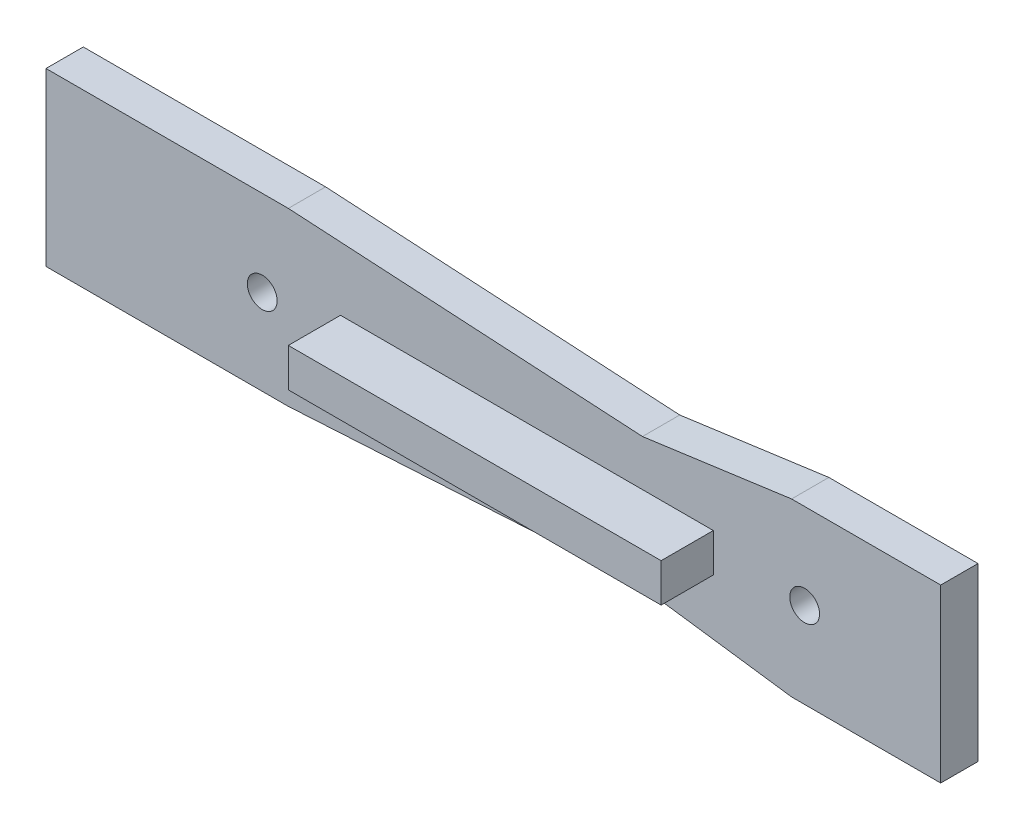
ISO-10303-21;
HEADER;
FILE_DESCRIPTION(('STEP AP214'),'2;1');
FILE_NAME('part.step','',(''),(''),'','','');
FILE_SCHEMA(('AUTOMOTIVE_DESIGN { 1 0 10303 214 1 1 1 1 }'));
ENDSEC;
DATA;
#1=APPLICATION_CONTEXT('core data for automotive mechanical design processes');
#2=APPLICATION_PROTOCOL_DEFINITION('international standard','automotive_design',2000,#1);
#3=PRODUCT_CONTEXT('',#1,'mechanical');
#4=PRODUCT('Part','Part','',(#3));
#5=PRODUCT_RELATED_PRODUCT_CATEGORY('part','',(#4));
#6=PRODUCT_DEFINITION_FORMATION('','',#4);
#7=PRODUCT_DEFINITION_CONTEXT('part definition',#1,'design');
#8=PRODUCT_DEFINITION('design','',#6,#7);
#9=PRODUCT_DEFINITION_SHAPE('','',#8);
#10=(LENGTH_UNIT() NAMED_UNIT(*) SI_UNIT(.MILLI.,.METRE.));
#11=(NAMED_UNIT(*) PLANE_ANGLE_UNIT() SI_UNIT($,.RADIAN.));
#12=(NAMED_UNIT(*) SI_UNIT($,.STERADIAN.) SOLID_ANGLE_UNIT());
#13=UNCERTAINTY_MEASURE_WITH_UNIT(LENGTH_MEASURE(1.E-05),#10,'distance_accuracy_value','');
#14=(GEOMETRIC_REPRESENTATION_CONTEXT(3) GLOBAL_UNCERTAINTY_ASSIGNED_CONTEXT((#13)) GLOBAL_UNIT_ASSIGNED_CONTEXT((#10,
#11,#12)) REPRESENTATION_CONTEXT('',''));
#15=CARTESIAN_POINT('',(0.,0.,0.));
#16=DIRECTION('',(0.,0.,1.));
#17=DIRECTION('',(1.,0.,0.));
#18=AXIS2_PLACEMENT_3D('',#15,#16,#17);
#19=CARTESIAN_POINT('',(0.,0.,10.));
#20=DIRECTION('',(0.,0.,1.));
#21=DIRECTION('',(1.,0.,0.));
#22=AXIS2_PLACEMENT_3D('',#19,#20,#21);
#23=PLANE('',#22);
#24=CARTESIAN_POINT('',(-62.,0.,10.));
#25=DIRECTION('',(0.,0.,1.));
#26=DIRECTION('',(1.,0.,0.));
#27=AXIS2_PLACEMENT_3D('',#24,#25,#26);
#28=CIRCLE('',#27,4.00000000000001);
#29=CARTESIAN_POINT('',(-58.,0.,10.));
#30=VERTEX_POINT('',#29);
#31=EDGE_CURVE('E162',#30,#30,#28,.T.);
#32=ORIENTED_EDGE('',*,*,#31,.F.);
#33=EDGE_LOOP('',(#32));
#34=FACE_BOUND('',#33,.T.);
#35=DIRECTION('',(-0.990678839845296,0.136218340478728,0.));
#36=VECTOR('',#35,1.);
#37=CARTESIAN_POINT('',(-1.61938353013342,-11.7773347646066,10.));
#38=LINE('',#37,#36);
#39=CARTESIAN_POINT('',(80.,-23.,10.));
#40=VERTEX_POINT('',#39);
#41=CARTESIAN_POINT('',(40.,-17.5,10.));
#42=VERTEX_POINT('',#41);
#43=EDGE_CURVE('E197',#40,#42,#38,.T.);
#44=ORIENTED_EDGE('',*,*,#43,.F.);
#45=DIRECTION('',(1.,0.,0.));
#46=VECTOR('',#45,1.);
#47=CARTESIAN_POINT('',(-120.,-23.,10.));
#48=LINE('',#47,#46);
#49=CARTESIAN_POINT('',(120.,-23.,10.));
#50=VERTEX_POINT('',#49);
#51=EDGE_CURVE('E226',#40,#50,#48,.T.);
#52=ORIENTED_EDGE('',*,*,#51,.T.);
#53=DIRECTION('',(0.,1.,0.));
#54=VECTOR('',#53,1.);
#55=CARTESIAN_POINT('',(120.,23.,10.));
#56=LINE('',#55,#54);
#57=CARTESIAN_POINT('',(120.,23.,10.));
#58=VERTEX_POINT('',#57);
#59=EDGE_CURVE('E231',#50,#58,#56,.T.);
#60=ORIENTED_EDGE('',*,*,#59,.T.);
#61=DIRECTION('',(-1.,0.,0.));
#62=VECTOR('',#61,1.);
#63=CARTESIAN_POINT('',(-120.,23.,10.));
#64=LINE('',#63,#62);
#65=CARTESIAN_POINT('',(80.,23.,10.));
#66=VERTEX_POINT('',#65);
#67=EDGE_CURVE('E234',#58,#66,#64,.T.);
#68=ORIENTED_EDGE('',*,*,#67,.T.);
#69=DIRECTION('',(0.990678839845296,0.136218340478728,0.));
#70=VECTOR('',#69,1.);
#71=CARTESIAN_POINT('',(-1.61938353013341,11.7773347646067,10.));
#72=LINE('',#71,#70);
#73=CARTESIAN_POINT('',(40.,17.5,10.));
#74=VERTEX_POINT('',#73);
#75=EDGE_CURVE('E212',#74,#66,#72,.T.);
#76=ORIENTED_EDGE('',*,*,#75,.F.);
#77=DIRECTION('',(0.998328300952499,-0.057797954265671,0.));
#78=VECTOR('',#77,1.);
#79=CARTESIAN_POINT('',(1.14339747660197,19.7495927776704,10.));
#80=LINE('',#79,#78);
#81=CARTESIAN_POINT('',(-55.,23.,10.));
#82=VERTEX_POINT('',#81);
#83=EDGE_CURVE('E186',#82,#74,#80,.T.);
#84=ORIENTED_EDGE('',*,*,#83,.F.);
#85=CARTESIAN_POINT('',(-120.,23.,10.));
#86=VERTEX_POINT('',#85);
#87=EDGE_CURVE('E233',#82,#86,#64,.T.);
#88=ORIENTED_EDGE('',*,*,#87,.T.);
#89=DIRECTION('',(0.,-1.,0.));
#90=VECTOR('',#89,1.);
#91=CARTESIAN_POINT('',(-120.,23.,10.));
#92=LINE('',#91,#90);
#93=CARTESIAN_POINT('',(-120.,-23.,10.));
#94=VERTEX_POINT('',#93);
#95=EDGE_CURVE('E223',#86,#94,#92,.T.);
#96=ORIENTED_EDGE('',*,*,#95,.T.);
#97=CARTESIAN_POINT('',(-55.,-23.,10.));
#98=VERTEX_POINT('',#97);
#99=EDGE_CURVE('E228',#94,#98,#48,.T.);
#100=ORIENTED_EDGE('',*,*,#99,.T.);
#101=DIRECTION('',(-0.998328300952499,-0.057797954265671,0.));
#102=VECTOR('',#101,1.);
#103=CARTESIAN_POINT('',(1.14339747660197,-19.7495927776704,10.));
#104=LINE('',#103,#102);
#105=EDGE_CURVE('E193',#42,#98,#104,.T.);
#106=ORIENTED_EDGE('',*,*,#105,.F.);
#107=EDGE_LOOP('',(#44,#52,#60,#68,#76,#84,#88,#96,#100,#106));
#108=FACE_BOUND('',#107,.T.);
#109=DIRECTION('',(0.,-1.,0.));
#110=VECTOR('',#109,1.);
#111=CARTESIAN_POINT('',(59.,5.16399704680839,10.));
#112=LINE('',#111,#110);
#113=CARTESIAN_POINT('',(59.,5.16399704680839,10.));
#114=VERTEX_POINT('',#113);
#115=CARTESIAN_POINT('',(59.,-5.16399704680839,10.));
#116=VERTEX_POINT('',#115);
#117=EDGE_CURVE('E174',#114,#116,#112,.T.);
#118=ORIENTED_EDGE('',*,*,#117,.T.);
#119=DIRECTION('',(1.,0.,0.));
#120=VECTOR('',#119,1.);
#121=CARTESIAN_POINT('',(-41.,-5.16399704680839,10.));
#122=LINE('',#121,#120);
#123=CARTESIAN_POINT('',(-41.,-5.16399704680839,10.));
#124=VERTEX_POINT('',#123);
#125=EDGE_CURVE('E158',#124,#116,#122,.T.);
#126=ORIENTED_EDGE('',*,*,#125,.F.);
#127=DIRECTION('',(0.,-1.,0.));
#128=VECTOR('',#127,1.);
#129=CARTESIAN_POINT('',(-41.,5.16399704680839,10.));
#130=LINE('',#129,#128);
#131=CARTESIAN_POINT('',(-41.,5.16399704680839,10.));
#132=VERTEX_POINT('',#131);
#133=EDGE_CURVE('E152',#132,#124,#130,.T.);
#134=ORIENTED_EDGE('',*,*,#133,.F.);
#135=DIRECTION('',(1.,0.,0.));
#136=VECTOR('',#135,1.);
#137=CARTESIAN_POINT('',(-41.,5.16399704680839,10.));
#138=LINE('',#137,#136);
#139=EDGE_CURVE('E54',#132,#114,#138,.T.);
#140=ORIENTED_EDGE('',*,*,#139,.T.);
#141=EDGE_LOOP('',(#118,#126,#134,#140));
#142=FACE_BOUND('',#141,.T.);
#143=CARTESIAN_POINT('',(83.5,0.,10.));
#144=DIRECTION('',(0.,0.,1.));
#145=DIRECTION('',(1.,0.,0.));
#146=AXIS2_PLACEMENT_3D('',#143,#144,#145);
#147=CIRCLE('',#146,4.00000000000001);
#148=CARTESIAN_POINT('',(87.5,0.,10.));
#149=VERTEX_POINT('',#148);
#150=EDGE_CURVE('E496',#149,#149,#147,.T.);
#151=ORIENTED_EDGE('',*,*,#150,.F.);
#152=EDGE_LOOP('',(#151));
#153=FACE_BOUND('',#152,.T.);
#154=ADVANCED_FACE('F39',(#34,#108,#142,#153),#23,.T.);
#155=CARTESIAN_POINT('',(-120.,-23.,10.));
#156=DIRECTION('',(0.,1.,0.));
#157=DIRECTION('',(0.,0.,1.));
#158=AXIS2_PLACEMENT_3D('',#155,#156,#157);
#159=PLANE('',#158);
#160=ORIENTED_EDGE('',*,*,#51,.F.);
#161=DIRECTION('',(0.,0.,1.));
#162=VECTOR('',#161,1.);
#163=CARTESIAN_POINT('',(80.,-23.,0.));
#164=LINE('',#163,#162);
#165=CARTESIAN_POINT('',(80.,-23.,0.));
#166=VERTEX_POINT('',#165);
#167=EDGE_CURVE('E202',#166,#40,#164,.T.);
#168=ORIENTED_EDGE('',*,*,#167,.F.);
#169=DIRECTION('',(1.,0.,0.));
#170=VECTOR('',#169,1.);
#171=CARTESIAN_POINT('',(-120.,-23.,0.));
#172=LINE('',#171,#170);
#173=CARTESIAN_POINT('',(120.,-23.,0.));
#174=VERTEX_POINT('',#173);
#175=EDGE_CURVE('E240',#166,#174,#172,.T.);
#176=ORIENTED_EDGE('',*,*,#175,.T.);
#177=DIRECTION('',(0.,0.,-1.));
#178=VECTOR('',#177,1.);
#179=CARTESIAN_POINT('',(120.,-23.,10.));
#180=LINE('',#179,#178);
#181=EDGE_CURVE('E47',#50,#174,#180,.T.);
#182=ORIENTED_EDGE('',*,*,#181,.F.);
#183=EDGE_LOOP('',(#160,#168,#176,#182));
#184=FACE_BOUND('',#183,.T.);
#185=ADVANCED_FACE('F277',(#184),#159,.F.);
#186=CARTESIAN_POINT('',(-120.,23.,10.));
#187=DIRECTION('',(0.,-1.,0.));
#188=DIRECTION('',(0.,0.,-1.));
#189=AXIS2_PLACEMENT_3D('',#186,#187,#188);
#190=PLANE('',#189);
#191=DIRECTION('',(-1.,0.,0.));
#192=VECTOR('',#191,1.);
#193=CARTESIAN_POINT('',(-120.,23.,0.));
#194=LINE('',#193,#192);
#195=CARTESIAN_POINT('',(120.,23.,0.));
#196=VERTEX_POINT('',#195);
#197=CARTESIAN_POINT('',(80.,23.,0.));
#198=VERTEX_POINT('',#197);
#199=EDGE_CURVE('E227',#196,#198,#194,.T.);
#200=ORIENTED_EDGE('',*,*,#199,.T.);
#201=DIRECTION('',(0.,0.,1.));
#202=VECTOR('',#201,1.);
#203=CARTESIAN_POINT('',(80.,23.,0.));
#204=LINE('',#203,#202);
#205=EDGE_CURVE('E200',#198,#66,#204,.T.);
#206=ORIENTED_EDGE('',*,*,#205,.T.);
#207=ORIENTED_EDGE('',*,*,#67,.F.);
#208=DIRECTION('',(0.,0.,-1.));
#209=VECTOR('',#208,1.);
#210=CARTESIAN_POINT('',(120.,23.,10.));
#211=LINE('',#210,#209);
#212=EDGE_CURVE('E251',#58,#196,#211,.T.);
#213=ORIENTED_EDGE('',*,*,#212,.T.);
#214=EDGE_LOOP('',(#200,#206,#207,#213));
#215=FACE_BOUND('',#214,.T.);
#216=ADVANCED_FACE('F268',(#215),#190,.F.);
#217=CARTESIAN_POINT('',(-120.,23.,10.));
#218=DIRECTION('',(1.,0.,0.));
#219=DIRECTION('',(0.,0.,-1.));
#220=AXIS2_PLACEMENT_3D('',#217,#218,#219);
#221=PLANE('',#220);
#222=DIRECTION('',(0.,-1.,0.));
#223=VECTOR('',#222,1.);
#224=CARTESIAN_POINT('',(-120.,23.,0.));
#225=LINE('',#224,#223);
#226=CARTESIAN_POINT('',(-120.,23.,0.));
#227=VERTEX_POINT('',#226);
#228=CARTESIAN_POINT('',(-120.,-23.,0.));
#229=VERTEX_POINT('',#228);
#230=EDGE_CURVE('E204',#227,#229,#225,.T.);
#231=ORIENTED_EDGE('',*,*,#230,.T.);
#232=DIRECTION('',(0.,0.,-1.));
#233=VECTOR('',#232,1.);
#234=CARTESIAN_POINT('',(-120.,-23.,10.));
#235=LINE('',#234,#233);
#236=EDGE_CURVE('E11',#94,#229,#235,.T.);
#237=ORIENTED_EDGE('',*,*,#236,.F.);
#238=ORIENTED_EDGE('',*,*,#95,.F.);
#239=DIRECTION('',(0.,0.,-1.));
#240=VECTOR('',#239,1.);
#241=CARTESIAN_POINT('',(-120.,23.,10.));
#242=LINE('',#241,#240);
#243=EDGE_CURVE('E237',#86,#227,#242,.T.);
#244=ORIENTED_EDGE('',*,*,#243,.T.);
#245=EDGE_LOOP('',(#231,#237,#238,#244));
#246=FACE_BOUND('',#245,.T.);
#247=ADVANCED_FACE('F41',(#246),#221,.F.);
#248=CARTESIAN_POINT('',(-55.0000000000128,-23.0000000000004,0.));
#249=VERTEX_POINT('',#248);
#250=EDGE_CURVE('E241',#229,#249,#172,.T.);
#251=ORIENTED_EDGE('',*,*,#250,.T.);
#252=DIRECTION('',(0.,0.,1.));
#253=VECTOR('',#252,1.);
#254=CARTESIAN_POINT('',(-55.,-23.,0.));
#255=LINE('',#254,#253);
#256=EDGE_CURVE('E205',#249,#98,#255,.T.);
#257=ORIENTED_EDGE('',*,*,#256,.T.);
#258=ORIENTED_EDGE('',*,*,#99,.F.);
#259=ORIENTED_EDGE('',*,*,#236,.T.);
#260=EDGE_LOOP('',(#251,#257,#258,#259));
#261=FACE_BOUND('',#260,.T.);
#262=ADVANCED_FACE('F284',(#261),#159,.F.);
#263=CARTESIAN_POINT('',(120.,23.,10.));
#264=DIRECTION('',(-1.,0.,0.));
#265=DIRECTION('',(0.,0.,1.));
#266=AXIS2_PLACEMENT_3D('',#263,#264,#265);
#267=PLANE('',#266);
#268=DIRECTION('',(0.,1.,0.));
#269=VECTOR('',#268,1.);
#270=CARTESIAN_POINT('',(120.,23.,0.));
#271=LINE('',#270,#269);
#272=EDGE_CURVE('E244',#174,#196,#271,.T.);
#273=ORIENTED_EDGE('',*,*,#272,.T.);
#274=ORIENTED_EDGE('',*,*,#212,.F.);
#275=ORIENTED_EDGE('',*,*,#59,.F.);
#276=ORIENTED_EDGE('',*,*,#181,.T.);
#277=EDGE_LOOP('',(#273,#274,#275,#276));
#278=FACE_BOUND('',#277,.T.);
#279=ADVANCED_FACE('F258',(#278),#267,.F.);
#280=ORIENTED_EDGE('',*,*,#87,.F.);
#281=DIRECTION('',(0.,0.,1.));
#282=VECTOR('',#281,1.);
#283=CARTESIAN_POINT('',(-55.,23.,0.));
#284=LINE('',#283,#282);
#285=CARTESIAN_POINT('',(-55.,23.,0.));
#286=VERTEX_POINT('',#285);
#287=EDGE_CURVE('E214',#286,#82,#284,.T.);
#288=ORIENTED_EDGE('',*,*,#287,.F.);
#289=EDGE_CURVE('E246',#286,#227,#194,.T.);
#290=ORIENTED_EDGE('',*,*,#289,.T.);
#291=ORIENTED_EDGE('',*,*,#243,.F.);
#292=EDGE_LOOP('',(#280,#288,#290,#291));
#293=FACE_BOUND('',#292,.T.);
#294=ADVANCED_FACE('F293',(#293),#190,.F.);
#295=CARTESIAN_POINT('',(0.,0.,0.));
#296=DIRECTION('',(0.,0.,1.));
#297=DIRECTION('',(1.,0.,0.));
#298=AXIS2_PLACEMENT_3D('',#295,#296,#297);
#299=PLANE('',#298);
#300=CARTESIAN_POINT('',(-62.,0.,0.));
#301=DIRECTION('',(0.,0.,1.));
#302=DIRECTION('',(1.,0.,0.));
#303=AXIS2_PLACEMENT_3D('',#300,#301,#302);
#304=CIRCLE('',#303,4.00000000000001);
#305=CARTESIAN_POINT('',(-58.,0.,0.));
#306=VERTEX_POINT('',#305);
#307=EDGE_CURVE('E183',#306,#306,#304,.T.);
#308=ORIENTED_EDGE('',*,*,#307,.T.);
#309=EDGE_LOOP('',(#308));
#310=FACE_BOUND('',#309,.T.);
#311=ORIENTED_EDGE('',*,*,#175,.F.);
#312=DIRECTION('',(-0.990678839845296,0.136218340478728,0.));
#313=VECTOR('',#312,1.);
#314=CARTESIAN_POINT('',(-1.61938353013342,-11.7773347646066,0.));
#315=LINE('',#314,#313);
#316=CARTESIAN_POINT('',(40.,-17.5,0.));
#317=VERTEX_POINT('',#316);
#318=EDGE_CURVE('E189',#166,#317,#315,.T.);
#319=ORIENTED_EDGE('',*,*,#318,.T.);
#320=DIRECTION('',(-0.998328300952499,-0.057797954265671,0.));
#321=VECTOR('',#320,1.);
#322=CARTESIAN_POINT('',(1.14339747660197,-19.7495927776704,0.));
#323=LINE('',#322,#321);
#324=EDGE_CURVE('E192',#317,#249,#323,.T.);
#325=ORIENTED_EDGE('',*,*,#324,.T.);
#326=ORIENTED_EDGE('',*,*,#250,.F.);
#327=ORIENTED_EDGE('',*,*,#230,.F.);
#328=ORIENTED_EDGE('',*,*,#289,.F.);
#329=DIRECTION('',(0.998328300952499,-0.057797954265671,0.));
#330=VECTOR('',#329,1.);
#331=CARTESIAN_POINT('',(1.14339747660197,19.7495927776704,0.));
#332=LINE('',#331,#330);
#333=CARTESIAN_POINT('',(40.,17.5,0.));
#334=VERTEX_POINT('',#333);
#335=EDGE_CURVE('E209',#286,#334,#332,.T.);
#336=ORIENTED_EDGE('',*,*,#335,.T.);
#337=DIRECTION('',(0.990678839845296,0.136218340478728,0.));
#338=VECTOR('',#337,1.);
#339=CARTESIAN_POINT('',(-1.61938353013341,11.7773347646067,0.));
#340=LINE('',#339,#338);
#341=EDGE_CURVE('E62',#334,#198,#340,.T.);
#342=ORIENTED_EDGE('',*,*,#341,.T.);
#343=ORIENTED_EDGE('',*,*,#199,.F.);
#344=ORIENTED_EDGE('',*,*,#272,.F.);
#345=EDGE_LOOP('',(#311,#319,#325,#326,#327,#328,#336,#342,#343,#344));
#346=FACE_BOUND('',#345,.T.);
#347=CARTESIAN_POINT('',(83.5,0.,0.));
#348=DIRECTION('',(0.,0.,1.));
#349=DIRECTION('',(1.,0.,0.));
#350=AXIS2_PLACEMENT_3D('',#347,#348,#349);
#351=CIRCLE('',#350,4.00000000000001);
#352=CARTESIAN_POINT('',(87.5,0.,0.));
#353=VERTEX_POINT('',#352);
#354=EDGE_CURVE('E175',#353,#353,#351,.T.);
#355=ORIENTED_EDGE('',*,*,#354,.T.);
#356=EDGE_LOOP('',(#355));
#357=FACE_BOUND('',#356,.T.);
#358=ADVANCED_FACE('F265',(#310,#346,#357),#299,.F.);
#359=CARTESIAN_POINT('',(-1.61938353013341,11.7773347646067,0.));
#360=DIRECTION('',(0.136218340478728,-0.990678839845296,0.));
#361=DIRECTION('',(0.990678839845296,0.136218340478728,0.));
#362=AXIS2_PLACEMENT_3D('',#359,#360,#361);
#363=PLANE('',#362);
#364=ORIENTED_EDGE('',*,*,#75,.T.);
#365=ORIENTED_EDGE('',*,*,#205,.F.);
#366=ORIENTED_EDGE('',*,*,#341,.F.);
#367=DIRECTION('',(0.,0.,1.));
#368=VECTOR('',#367,1.);
#369=CARTESIAN_POINT('',(40.,17.5,0.));
#370=LINE('',#369,#368);
#371=EDGE_CURVE('E220',#334,#74,#370,.T.);
#372=ORIENTED_EDGE('',*,*,#371,.T.);
#373=EDGE_LOOP('',(#364,#365,#366,#372));
#374=FACE_BOUND('',#373,.T.);
#375=ADVANCED_FACE('F319',(#374),#363,.F.);
#376=CARTESIAN_POINT('',(1.14339747660197,19.7495927776704,0.));
#377=DIRECTION('',(-0.057797954265671,-0.998328300952499,0.));
#378=DIRECTION('',(0.998328300952499,-0.057797954265671,0.));
#379=AXIS2_PLACEMENT_3D('',#376,#377,#378);
#380=PLANE('',#379);
#381=ORIENTED_EDGE('',*,*,#83,.T.);
#382=ORIENTED_EDGE('',*,*,#371,.F.);
#383=ORIENTED_EDGE('',*,*,#335,.F.);
#384=ORIENTED_EDGE('',*,*,#287,.T.);
#385=EDGE_LOOP('',(#381,#382,#383,#384));
#386=FACE_BOUND('',#385,.T.);
#387=ADVANCED_FACE('F295',(#386),#380,.F.);
#388=CARTESIAN_POINT('',(-1.61938353013342,-11.7773347646066,0.));
#389=DIRECTION('',(0.136218340478728,0.990678839845296,0.));
#390=DIRECTION('',(-0.990678839845296,0.136218340478728,0.));
#391=AXIS2_PLACEMENT_3D('',#388,#389,#390);
#392=PLANE('',#391);
#393=ORIENTED_EDGE('',*,*,#43,.T.);
#394=DIRECTION('',(0.,0.,1.));
#395=VECTOR('',#394,1.);
#396=CARTESIAN_POINT('',(40.,-17.5,0.));
#397=LINE('',#396,#395);
#398=EDGE_CURVE('E196',#317,#42,#397,.T.);
#399=ORIENTED_EDGE('',*,*,#398,.F.);
#400=ORIENTED_EDGE('',*,*,#318,.F.);
#401=ORIENTED_EDGE('',*,*,#167,.T.);
#402=EDGE_LOOP('',(#393,#399,#400,#401));
#403=FACE_BOUND('',#402,.T.);
#404=ADVANCED_FACE('F279',(#403),#392,.F.);
#405=CARTESIAN_POINT('',(1.14339747660197,-19.7495927776704,0.));
#406=DIRECTION('',(-0.057797954265671,0.998328300952499,0.));
#407=DIRECTION('',(-0.998328300952499,-0.057797954265671,0.));
#408=AXIS2_PLACEMENT_3D('',#405,#406,#407);
#409=PLANE('',#408);
#410=ORIENTED_EDGE('',*,*,#105,.T.);
#411=ORIENTED_EDGE('',*,*,#256,.F.);
#412=ORIENTED_EDGE('',*,*,#324,.F.);
#413=ORIENTED_EDGE('',*,*,#398,.T.);
#414=EDGE_LOOP('',(#410,#411,#412,#413));
#415=FACE_BOUND('',#414,.T.);
#416=ADVANCED_FACE('F296',(#415),#409,.F.);
#417=CARTESIAN_POINT('',(-62.,0.,0.));
#418=DIRECTION('',(0.,0.,1.));
#419=DIRECTION('',(1.,0.,0.));
#420=AXIS2_PLACEMENT_3D('',#417,#418,#419);
#421=CYLINDRICAL_SURFACE('',#420,4.00000000000001);
#422=ORIENTED_EDGE('',*,*,#307,.F.);
#423=EDGE_LOOP('',(#422));
#424=FACE_BOUND('',#423,.T.);
#425=ORIENTED_EDGE('',*,*,#31,.T.);
#426=EDGE_LOOP('',(#425));
#427=FACE_BOUND('',#426,.T.);
#428=ADVANCED_FACE('F298',(#424,#427),#421,.F.);
#429=CARTESIAN_POINT('',(-41.,-5.16399704680839,24.));
#430=DIRECTION('',(0.,1.,0.));
#431=DIRECTION('',(0.,0.,1.));
#432=AXIS2_PLACEMENT_3D('',#429,#430,#431);
#433=PLANE('',#432);
#434=ORIENTED_EDGE('',*,*,#125,.T.);
#435=DIRECTION('',(0.,0.,-1.));
#436=VECTOR('',#435,1.);
#437=CARTESIAN_POINT('',(59.,-5.16399704680839,24.));
#438=LINE('',#437,#436);
#439=CARTESIAN_POINT('',(59.,-5.16399704680839,24.));
#440=VERTEX_POINT('',#439);
#441=EDGE_CURVE('E155',#440,#116,#438,.T.);
#442=ORIENTED_EDGE('',*,*,#441,.F.);
#443=DIRECTION('',(1.,0.,0.));
#444=VECTOR('',#443,1.);
#445=CARTESIAN_POINT('',(-41.,-5.16399704680839,24.));
#446=LINE('',#445,#444);
#447=CARTESIAN_POINT('',(-41.,-5.16399704680839,24.));
#448=VERTEX_POINT('',#447);
#449=EDGE_CURVE('E140',#448,#440,#446,.T.);
#450=ORIENTED_EDGE('',*,*,#449,.F.);
#451=DIRECTION('',(0.,0.,-1.));
#452=VECTOR('',#451,1.);
#453=CARTESIAN_POINT('',(-41.,-5.16399704680839,24.));
#454=LINE('',#453,#452);
#455=EDGE_CURVE('E172',#448,#124,#454,.T.);
#456=ORIENTED_EDGE('',*,*,#455,.T.);
#457=EDGE_LOOP('',(#434,#442,#450,#456));
#458=FACE_BOUND('',#457,.T.);
#459=ADVANCED_FACE('F156',(#458),#433,.F.);
#460=CARTESIAN_POINT('',(59.,5.16399704680839,24.));
#461=DIRECTION('',(1.,0.,0.));
#462=DIRECTION('',(0.,0.,-1.));
#463=AXIS2_PLACEMENT_3D('',#460,#461,#462);
#464=PLANE('',#463);
#465=ORIENTED_EDGE('',*,*,#117,.F.);
#466=DIRECTION('',(0.,0.,-1.));
#467=VECTOR('',#466,1.);
#468=CARTESIAN_POINT('',(59.,5.16399704680839,24.));
#469=LINE('',#468,#467);
#470=CARTESIAN_POINT('',(59.,5.16399704680839,24.));
#471=VERTEX_POINT('',#470);
#472=EDGE_CURVE('E163',#471,#114,#469,.T.);
#473=ORIENTED_EDGE('',*,*,#472,.F.);
#474=DIRECTION('',(0.,-1.,0.));
#475=VECTOR('',#474,1.);
#476=CARTESIAN_POINT('',(59.,5.16399704680839,24.));
#477=LINE('',#476,#475);
#478=EDGE_CURVE('E145',#471,#440,#477,.T.);
#479=ORIENTED_EDGE('',*,*,#478,.T.);
#480=ORIENTED_EDGE('',*,*,#441,.T.);
#481=EDGE_LOOP('',(#465,#473,#479,#480));
#482=FACE_BOUND('',#481,.T.);
#483=ADVANCED_FACE('F165',(#482),#464,.T.);
#484=CARTESIAN_POINT('',(-41.,5.16399704680839,24.));
#485=DIRECTION('',(0.,1.,0.));
#486=DIRECTION('',(0.,0.,1.));
#487=AXIS2_PLACEMENT_3D('',#484,#485,#486);
#488=PLANE('',#487);
#489=ORIENTED_EDGE('',*,*,#139,.F.);
#490=DIRECTION('',(0.,0.,-1.));
#491=VECTOR('',#490,1.);
#492=CARTESIAN_POINT('',(-41.,5.16399704680839,24.));
#493=LINE('',#492,#491);
#494=CARTESIAN_POINT('',(-41.,5.16399704680839,24.));
#495=VERTEX_POINT('',#494);
#496=EDGE_CURVE('E180',#495,#132,#493,.T.);
#497=ORIENTED_EDGE('',*,*,#496,.F.);
#498=DIRECTION('',(1.,0.,0.));
#499=VECTOR('',#498,1.);
#500=CARTESIAN_POINT('',(-41.,5.16399704680839,24.));
#501=LINE('',#500,#499);
#502=EDGE_CURVE('E166',#495,#471,#501,.T.);
#503=ORIENTED_EDGE('',*,*,#502,.T.);
#504=ORIENTED_EDGE('',*,*,#472,.T.);
#505=EDGE_LOOP('',(#489,#497,#503,#504));
#506=FACE_BOUND('',#505,.T.);
#507=ADVANCED_FACE('F419',(#506),#488,.T.);
#508=CARTESIAN_POINT('',(-41.,5.16399704680839,24.));
#509=DIRECTION('',(1.,0.,0.));
#510=DIRECTION('',(0.,0.,-1.));
#511=AXIS2_PLACEMENT_3D('',#508,#509,#510);
#512=PLANE('',#511);
#513=ORIENTED_EDGE('',*,*,#133,.T.);
#514=ORIENTED_EDGE('',*,*,#455,.F.);
#515=DIRECTION('',(0.,-1.,0.));
#516=VECTOR('',#515,1.);
#517=CARTESIAN_POINT('',(-41.,5.16399704680839,24.));
#518=LINE('',#517,#516);
#519=EDGE_CURVE('E148',#495,#448,#518,.T.);
#520=ORIENTED_EDGE('',*,*,#519,.F.);
#521=ORIENTED_EDGE('',*,*,#496,.T.);
#522=EDGE_LOOP('',(#513,#514,#520,#521));
#523=FACE_BOUND('',#522,.T.);
#524=ADVANCED_FACE('F429',(#523),#512,.F.);
#525=CARTESIAN_POINT('',(0.,0.,24.));
#526=DIRECTION('',(0.,0.,-1.));
#527=DIRECTION('',(-1.,0.,0.));
#528=AXIS2_PLACEMENT_3D('',#525,#526,#527);
#529=PLANE('',#528);
#530=ORIENTED_EDGE('',*,*,#449,.T.);
#531=ORIENTED_EDGE('',*,*,#478,.F.);
#532=ORIENTED_EDGE('',*,*,#502,.F.);
#533=ORIENTED_EDGE('',*,*,#519,.T.);
#534=EDGE_LOOP('',(#530,#531,#532,#533));
#535=FACE_BOUND('',#534,.T.);
#536=ADVANCED_FACE('F142',(#535),#529,.F.);
#537=CARTESIAN_POINT('',(83.5,0.,0.));
#538=DIRECTION('',(0.,0.,1.));
#539=DIRECTION('',(1.,0.,0.));
#540=AXIS2_PLACEMENT_3D('',#537,#538,#539);
#541=CYLINDRICAL_SURFACE('',#540,4.00000000000001);
#542=ORIENTED_EDGE('',*,*,#354,.F.);
#543=EDGE_LOOP('',(#542));
#544=FACE_BOUND('',#543,.T.);
#545=ORIENTED_EDGE('',*,*,#150,.T.);
#546=EDGE_LOOP('',(#545));
#547=FACE_BOUND('',#546,.T.);
#548=ADVANCED_FACE('F448',(#544,#547),#541,.F.);
#549=CLOSED_SHELL('',(#154,#185,#216,#247,#262,#279,#294,#358,#375,#387,#404,#416,#428,#459,
#483,#507,#524,#536,#548));
#550=MANIFOLD_SOLID_BREP('B2',#549);
#551=ADVANCED_BREP_SHAPE_REPRESENTATION('',(#18,#550),#14);
#552=SHAPE_DEFINITION_REPRESENTATION(#9,#551);
ENDSEC;
END-ISO-10303-21;
